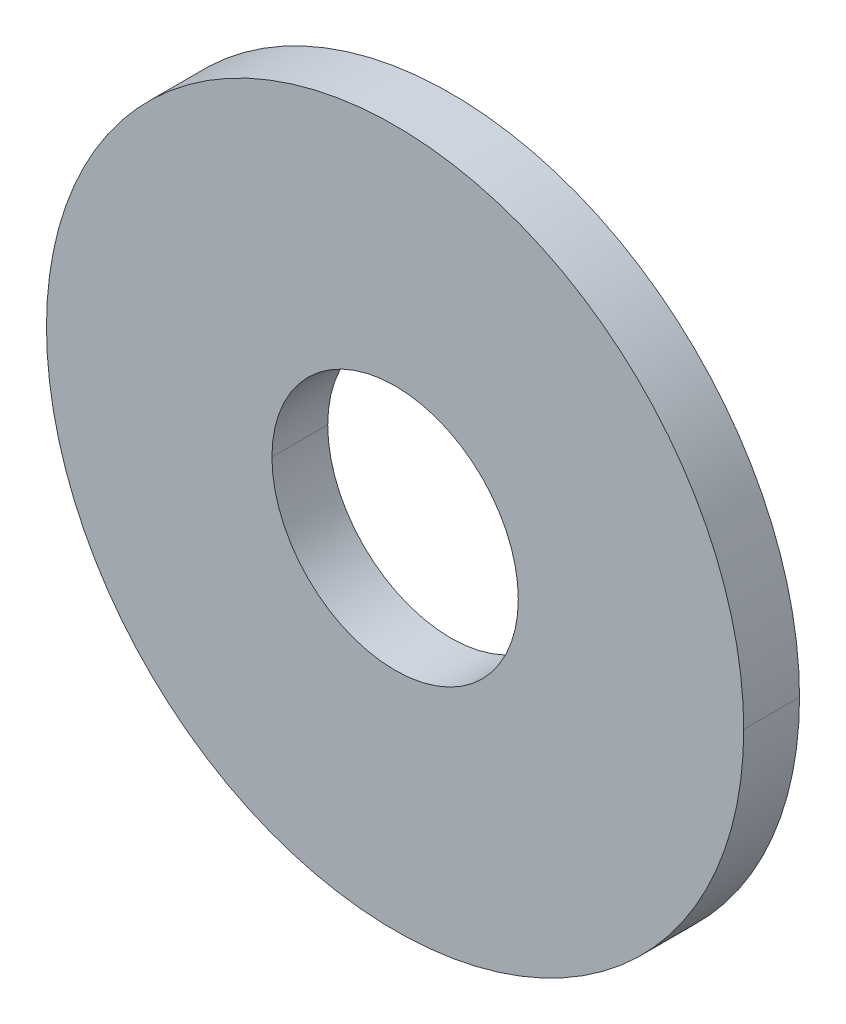
ISO-10303-21;
HEADER;
FILE_DESCRIPTION(('STEP AP214'),'2;1');
FILE_NAME('part.step','',(''),(''),'','','');
FILE_SCHEMA(('AUTOMOTIVE_DESIGN { 1 0 10303 214 1 1 1 1 }'));
ENDSEC;
DATA;
#1=APPLICATION_CONTEXT('core data for automotive mechanical design processes');
#2=APPLICATION_PROTOCOL_DEFINITION('international standard','automotive_design',2000,#1);
#3=PRODUCT_CONTEXT('',#1,'mechanical');
#4=PRODUCT('Part','Part','',(#3));
#5=PRODUCT_RELATED_PRODUCT_CATEGORY('part','',(#4));
#6=PRODUCT_DEFINITION_FORMATION('','',#4);
#7=PRODUCT_DEFINITION_CONTEXT('part definition',#1,'design');
#8=PRODUCT_DEFINITION('design','',#6,#7);
#9=PRODUCT_DEFINITION_SHAPE('','',#8);
#10=(LENGTH_UNIT() NAMED_UNIT(*) SI_UNIT(.MILLI.,.METRE.));
#11=(NAMED_UNIT(*) PLANE_ANGLE_UNIT() SI_UNIT($,.RADIAN.));
#12=(NAMED_UNIT(*) SI_UNIT($,.STERADIAN.) SOLID_ANGLE_UNIT());
#13=UNCERTAINTY_MEASURE_WITH_UNIT(LENGTH_MEASURE(1.E-05),#10,'distance_accuracy_value','');
#14=(GEOMETRIC_REPRESENTATION_CONTEXT(3) GLOBAL_UNCERTAINTY_ASSIGNED_CONTEXT((#13)) GLOBAL_UNIT_ASSIGNED_CONTEXT((#10,
#11,#12)) REPRESENTATION_CONTEXT('',''));
#15=CARTESIAN_POINT('',(0.,0.,0.));
#16=DIRECTION('',(0.,0.,1.));
#17=DIRECTION('',(1.,0.,0.));
#18=AXIS2_PLACEMENT_3D('',#15,#16,#17);
#19=CARTESIAN_POINT('',(0.,0.,1.2));
#20=DIRECTION('',(0.,0.,-1.));
#21=DIRECTION('',(-1.,0.,0.));
#22=AXIS2_PLACEMENT_3D('',#19,#20,#21);
#23=CYLINDRICAL_SURFACE('',#22,2.65);
#24=DIRECTION('',(0.,0.,-1.));
#25=VECTOR('',#24,1.);
#26=CARTESIAN_POINT('',(2.65,0.,1.2));
#27=LINE('',#26,#25);
#28=CARTESIAN_POINT('',(2.65,0.,1.2));
#29=VERTEX_POINT('',#28);
#30=CARTESIAN_POINT('',(2.65,0.,0.));
#31=VERTEX_POINT('',#30);
#32=EDGE_CURVE('E103',#29,#31,#27,.T.);
#33=ORIENTED_EDGE('',*,*,#32,.F.);
#34=CARTESIAN_POINT('',(0.,0.,1.2));
#35=DIRECTION('',(0.,0.,1.));
#36=DIRECTION('',(1.,0.,0.));
#37=AXIS2_PLACEMENT_3D('',#34,#35,#36);
#38=CIRCLE('',#37,2.65);
#39=CARTESIAN_POINT('',(-2.65,0.,1.2));
#40=VERTEX_POINT('',#39);
#41=EDGE_CURVE('E76',#29,#40,#38,.T.);
#42=ORIENTED_EDGE('',*,*,#41,.T.);
#43=DIRECTION('',(0.,0.,-1.));
#44=VECTOR('',#43,1.);
#45=CARTESIAN_POINT('',(-2.65,0.,1.2));
#46=LINE('',#45,#44);
#47=CARTESIAN_POINT('',(-2.65,0.,0.));
#48=VERTEX_POINT('',#47);
#49=EDGE_CURVE('E19',#40,#48,#46,.T.);
#50=ORIENTED_EDGE('',*,*,#49,.T.);
#51=CARTESIAN_POINT('',(0.,0.,0.));
#52=DIRECTION('',(0.,0.,1.));
#53=DIRECTION('',(1.,0.,0.));
#54=AXIS2_PLACEMENT_3D('',#51,#52,#53);
#55=CIRCLE('',#54,2.65);
#56=EDGE_CURVE('E10',#31,#48,#55,.T.);
#57=ORIENTED_EDGE('',*,*,#56,.F.);
#58=EDGE_LOOP('',(#33,#42,#50,#57));
#59=FACE_BOUND('',#58,.T.);
#60=ADVANCED_FACE('F16',(#59),#23,.F.);
#61=CARTESIAN_POINT('',(0.,0.,1.2));
#62=DIRECTION('',(0.,0.,-1.));
#63=DIRECTION('',(-1.,0.,0.));
#64=AXIS2_PLACEMENT_3D('',#61,#62,#63);
#65=CYLINDRICAL_SURFACE('',#64,7.5);
#66=DIRECTION('',(0.,0.,-1.));
#67=VECTOR('',#66,1.);
#68=CARTESIAN_POINT('',(7.5,0.,1.2));
#69=LINE('',#68,#67);
#70=CARTESIAN_POINT('',(7.5,0.,1.2));
#71=VERTEX_POINT('',#70);
#72=CARTESIAN_POINT('',(7.5,0.,0.));
#73=VERTEX_POINT('',#72);
#74=EDGE_CURVE('E71',#71,#73,#69,.T.);
#75=ORIENTED_EDGE('',*,*,#74,.F.);
#76=CARTESIAN_POINT('',(0.,0.,1.2));
#77=DIRECTION('',(0.,0.,1.));
#78=DIRECTION('',(1.,0.,0.));
#79=AXIS2_PLACEMENT_3D('',#76,#77,#78);
#80=CIRCLE('',#79,7.5);
#81=CARTESIAN_POINT('',(-7.5,0.,1.2));
#82=VERTEX_POINT('',#81);
#83=EDGE_CURVE('E65',#82,#71,#80,.T.);
#84=ORIENTED_EDGE('',*,*,#83,.F.);
#85=DIRECTION('',(0.,0.,-1.));
#86=VECTOR('',#85,1.);
#87=CARTESIAN_POINT('',(-7.5,0.,1.2));
#88=LINE('',#87,#86);
#89=CARTESIAN_POINT('',(-7.5,0.,0.));
#90=VERTEX_POINT('',#89);
#91=EDGE_CURVE('E68',#82,#90,#88,.T.);
#92=ORIENTED_EDGE('',*,*,#91,.T.);
#93=CARTESIAN_POINT('',(0.,0.,0.));
#94=DIRECTION('',(0.,0.,1.));
#95=DIRECTION('',(1.,0.,0.));
#96=AXIS2_PLACEMENT_3D('',#93,#94,#95);
#97=CIRCLE('',#96,7.5);
#98=EDGE_CURVE('E26',#90,#73,#97,.T.);
#99=ORIENTED_EDGE('',*,*,#98,.T.);
#100=EDGE_LOOP('',(#75,#84,#92,#99));
#101=FACE_BOUND('',#100,.T.);
#102=ADVANCED_FACE('F67',(#101),#65,.T.);
#103=CARTESIAN_POINT('',(0.,0.,0.));
#104=DIRECTION('',(0.,0.,1.));
#105=DIRECTION('',(1.,0.,0.));
#106=AXIS2_PLACEMENT_3D('',#103,#104,#105);
#107=PLANE('',#106);
#108=CARTESIAN_POINT('',(0.,0.,0.));
#109=DIRECTION('',(0.,0.,1.));
#110=DIRECTION('',(1.,0.,0.));
#111=AXIS2_PLACEMENT_3D('',#108,#109,#110);
#112=CIRCLE('',#111,2.65);
#113=EDGE_CURVE('E94',#48,#31,#112,.T.);
#114=ORIENTED_EDGE('',*,*,#113,.T.);
#115=ORIENTED_EDGE('',*,*,#56,.T.);
#116=EDGE_LOOP('',(#114,#115));
#117=FACE_BOUND('',#116,.T.);
#118=ORIENTED_EDGE('',*,*,#98,.F.);
#119=CARTESIAN_POINT('',(0.,0.,0.));
#120=DIRECTION('',(0.,0.,1.));
#121=DIRECTION('',(1.,0.,0.));
#122=AXIS2_PLACEMENT_3D('',#119,#120,#121);
#123=CIRCLE('',#122,7.5);
#124=EDGE_CURVE('E81',#73,#90,#123,.T.);
#125=ORIENTED_EDGE('',*,*,#124,.F.);
#126=EDGE_LOOP('',(#118,#125));
#127=FACE_BOUND('',#126,.T.);
#128=ADVANCED_FACE('F121',(#117,#127),#107,.F.);
#129=CARTESIAN_POINT('',(0.,0.,1.2));
#130=DIRECTION('',(0.,0.,1.));
#131=DIRECTION('',(1.,0.,0.));
#132=AXIS2_PLACEMENT_3D('',#129,#130,#131);
#133=PLANE('',#132);
#134=CARTESIAN_POINT('',(0.,0.,1.2));
#135=DIRECTION('',(0.,0.,1.));
#136=DIRECTION('',(1.,0.,0.));
#137=AXIS2_PLACEMENT_3D('',#134,#135,#136);
#138=CIRCLE('',#137,2.65);
#139=EDGE_CURVE('E99',#40,#29,#138,.T.);
#140=ORIENTED_EDGE('',*,*,#139,.F.);
#141=ORIENTED_EDGE('',*,*,#41,.F.);
#142=EDGE_LOOP('',(#140,#141));
#143=FACE_BOUND('',#142,.T.);
#144=ORIENTED_EDGE('',*,*,#83,.T.);
#145=CARTESIAN_POINT('',(0.,0.,1.2));
#146=DIRECTION('',(0.,0.,1.));
#147=DIRECTION('',(1.,0.,0.));
#148=AXIS2_PLACEMENT_3D('',#145,#146,#147);
#149=CIRCLE('',#148,7.5);
#150=EDGE_CURVE('E80',#71,#82,#149,.T.);
#151=ORIENTED_EDGE('',*,*,#150,.T.);
#152=EDGE_LOOP('',(#144,#151));
#153=FACE_BOUND('',#152,.T.);
#154=ADVANCED_FACE('F84',(#143,#153),#133,.T.);
#155=CARTESIAN_POINT('',(0.,0.,1.2));
#156=DIRECTION('',(0.,0.,-1.));
#157=DIRECTION('',(-1.,0.,0.));
#158=AXIS2_PLACEMENT_3D('',#155,#156,#157);
#159=CYLINDRICAL_SURFACE('',#158,7.5);
#160=ORIENTED_EDGE('',*,*,#150,.F.);
#161=ORIENTED_EDGE('',*,*,#74,.T.);
#162=ORIENTED_EDGE('',*,*,#124,.T.);
#163=ORIENTED_EDGE('',*,*,#91,.F.);
#164=EDGE_LOOP('',(#160,#161,#162,#163));
#165=FACE_BOUND('',#164,.T.);
#166=ADVANCED_FACE('F79',(#165),#159,.T.);
#167=CARTESIAN_POINT('',(0.,0.,1.2));
#168=DIRECTION('',(0.,0.,-1.));
#169=DIRECTION('',(-1.,0.,0.));
#170=AXIS2_PLACEMENT_3D('',#167,#168,#169);
#171=CYLINDRICAL_SURFACE('',#170,2.65);
#172=ORIENTED_EDGE('',*,*,#139,.T.);
#173=ORIENTED_EDGE('',*,*,#32,.T.);
#174=ORIENTED_EDGE('',*,*,#113,.F.);
#175=ORIENTED_EDGE('',*,*,#49,.F.);
#176=EDGE_LOOP('',(#172,#173,#174,#175));
#177=FACE_BOUND('',#176,.T.);
#178=ADVANCED_FACE('F116',(#177),#171,.F.);
#179=CLOSED_SHELL('',(#60,#102,#128,#154,#166,#178));
#180=MANIFOLD_SOLID_BREP('B1',#179);
#181=ADVANCED_BREP_SHAPE_REPRESENTATION('',(#18,#180),#14);
#182=SHAPE_DEFINITION_REPRESENTATION(#9,#181);
ENDSEC;
END-ISO-10303-21;
